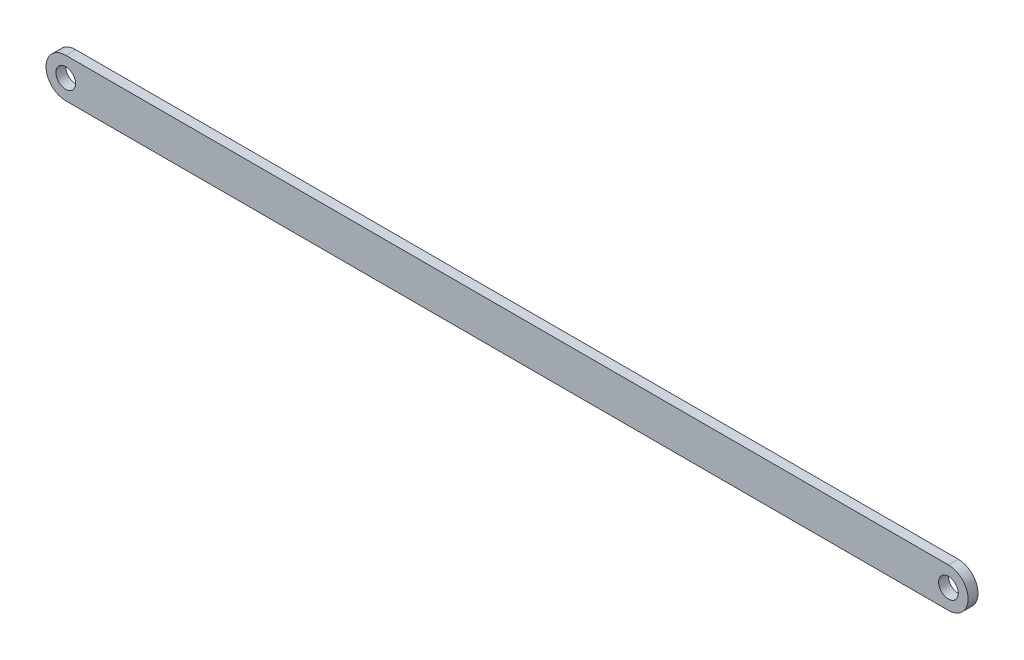
ISO-10303-21;
HEADER;
FILE_DESCRIPTION(('STEP AP214'),'2;1');
FILE_NAME('part.step','',(''),(''),'','','');
FILE_SCHEMA(('AUTOMOTIVE_DESIGN { 1 0 10303 214 1 1 1 1 }'));
ENDSEC;
DATA;
#1=APPLICATION_CONTEXT('core data for automotive mechanical design processes');
#2=APPLICATION_PROTOCOL_DEFINITION('international standard','automotive_design',2000,#1);
#3=PRODUCT_CONTEXT('',#1,'mechanical');
#4=PRODUCT('Part','Part','',(#3));
#5=PRODUCT_RELATED_PRODUCT_CATEGORY('part','',(#4));
#6=PRODUCT_DEFINITION_FORMATION('','',#4);
#7=PRODUCT_DEFINITION_CONTEXT('part definition',#1,'design');
#8=PRODUCT_DEFINITION('design','',#6,#7);
#9=PRODUCT_DEFINITION_SHAPE('','',#8);
#10=(LENGTH_UNIT() NAMED_UNIT(*) SI_UNIT(.MILLI.,.METRE.));
#11=(NAMED_UNIT(*) PLANE_ANGLE_UNIT() SI_UNIT($,.RADIAN.));
#12=(NAMED_UNIT(*) SI_UNIT($,.STERADIAN.) SOLID_ANGLE_UNIT());
#13=UNCERTAINTY_MEASURE_WITH_UNIT(LENGTH_MEASURE(1.E-05),#10,'distance_accuracy_value','');
#14=(GEOMETRIC_REPRESENTATION_CONTEXT(3) GLOBAL_UNCERTAINTY_ASSIGNED_CONTEXT((#13)) GLOBAL_UNIT_ASSIGNED_CONTEXT((#10,
#11,#12)) REPRESENTATION_CONTEXT('',''));
#15=CARTESIAN_POINT('',(0.,0.,0.));
#16=DIRECTION('',(0.,0.,1.));
#17=DIRECTION('',(1.,0.,0.));
#18=AXIS2_PLACEMENT_3D('',#15,#16,#17);
#19=CARTESIAN_POINT('',(44.785,0.,1.));
#20=DIRECTION('',(0.,0.,-1.));
#21=DIRECTION('',(-1.,0.,0.));
#22=AXIS2_PLACEMENT_3D('',#19,#20,#21);
#23=PLANE('',#22);
#24=CARTESIAN_POINT('',(44.785,0.,1.));
#25=DIRECTION('',(0.,0.,1.));
#26=DIRECTION('',(-1.,0.,0.));
#27=AXIS2_PLACEMENT_3D('',#24,#25,#26);
#28=CIRCLE('',#27,2.);
#29=CARTESIAN_POINT('',(44.785,-2.,1.));
#30=VERTEX_POINT('',#29);
#31=CARTESIAN_POINT('',(44.785,2.,1.));
#32=VERTEX_POINT('',#31);
#33=EDGE_CURVE('E96',#30,#32,#28,.T.);
#34=ORIENTED_EDGE('',*,*,#33,.T.);
#35=DIRECTION('',(-1.,0.,0.));
#36=VECTOR('',#35,1.);
#37=CARTESIAN_POINT('',(-44.785,2.,1.));
#38=LINE('',#37,#36);
#39=CARTESIAN_POINT('',(-44.785,2.,1.));
#40=VERTEX_POINT('',#39);
#41=EDGE_CURVE('E91',#32,#40,#38,.T.);
#42=ORIENTED_EDGE('',*,*,#41,.T.);
#43=CARTESIAN_POINT('',(-44.785,0.,1.));
#44=DIRECTION('',(0.,0.,1.));
#45=DIRECTION('',(1.,0.,0.));
#46=AXIS2_PLACEMENT_3D('',#43,#44,#45);
#47=CIRCLE('',#46,2.);
#48=CARTESIAN_POINT('',(-44.785,-2.,1.));
#49=VERTEX_POINT('',#48);
#50=EDGE_CURVE('E94',#40,#49,#47,.T.);
#51=ORIENTED_EDGE('',*,*,#50,.T.);
#52=DIRECTION('',(1.,0.,0.));
#53=VECTOR('',#52,1.);
#54=CARTESIAN_POINT('',(-44.785,-2.,1.));
#55=LINE('',#54,#53);
#56=EDGE_CURVE('E61',#49,#30,#55,.T.);
#57=ORIENTED_EDGE('',*,*,#56,.T.);
#58=EDGE_LOOP('',(#34,#42,#51,#57));
#59=FACE_BOUND('',#58,.T.);
#60=CARTESIAN_POINT('',(-44.785,0.,1.));
#61=DIRECTION('',(0.,0.,1.));
#62=DIRECTION('',(1.,0.,0.));
#63=AXIS2_PLACEMENT_3D('',#60,#61,#62);
#64=CIRCLE('',#63,0.999999999999998);
#65=CARTESIAN_POINT('',(-43.785,0.,1.));
#66=VERTEX_POINT('',#65);
#67=EDGE_CURVE('E116',#66,#66,#64,.T.);
#68=ORIENTED_EDGE('',*,*,#67,.F.);
#69=EDGE_LOOP('',(#68));
#70=FACE_BOUND('',#69,.T.);
#71=CARTESIAN_POINT('',(44.785,0.,1.));
#72=DIRECTION('',(0.,0.,1.));
#73=DIRECTION('',(1.,0.,0.));
#74=AXIS2_PLACEMENT_3D('',#71,#72,#73);
#75=CIRCLE('',#74,0.999999999999998);
#76=CARTESIAN_POINT('',(45.785,0.,1.));
#77=VERTEX_POINT('',#76);
#78=EDGE_CURVE('E138',#77,#77,#75,.T.);
#79=ORIENTED_EDGE('',*,*,#78,.F.);
#80=EDGE_LOOP('',(#79));
#81=FACE_BOUND('',#80,.T.);
#82=ADVANCED_FACE('F43',(#59,#70,#81),#23,.F.);
#83=CARTESIAN_POINT('',(44.785,0.,0.));
#84=DIRECTION('',(0.,0.,-1.));
#85=DIRECTION('',(-1.,0.,0.));
#86=AXIS2_PLACEMENT_3D('',#83,#84,#85);
#87=PLANE('',#86);
#88=CARTESIAN_POINT('',(-44.785,0.,0.));
#89=DIRECTION('',(0.,0.,1.));
#90=DIRECTION('',(1.,0.,0.));
#91=AXIS2_PLACEMENT_3D('',#88,#89,#90);
#92=CIRCLE('',#91,0.999999999999998);
#93=CARTESIAN_POINT('',(-43.785,0.,0.));
#94=VERTEX_POINT('',#93);
#95=EDGE_CURVE('E134',#94,#94,#92,.T.);
#96=ORIENTED_EDGE('',*,*,#95,.T.);
#97=EDGE_LOOP('',(#96));
#98=FACE_BOUND('',#97,.T.);
#99=CARTESIAN_POINT('',(44.785,0.,0.));
#100=DIRECTION('',(0.,0.,1.));
#101=DIRECTION('',(-1.,0.,0.));
#102=AXIS2_PLACEMENT_3D('',#99,#100,#101);
#103=CIRCLE('',#102,2.);
#104=CARTESIAN_POINT('',(44.785,-2.,0.));
#105=VERTEX_POINT('',#104);
#106=CARTESIAN_POINT('',(44.785,2.,0.));
#107=VERTEX_POINT('',#106);
#108=EDGE_CURVE('E112',#105,#107,#103,.T.);
#109=ORIENTED_EDGE('',*,*,#108,.F.);
#110=DIRECTION('',(1.,0.,0.));
#111=VECTOR('',#110,1.);
#112=CARTESIAN_POINT('',(-44.785,-2.,0.));
#113=LINE('',#112,#111);
#114=CARTESIAN_POINT('',(-44.785,-2.,0.));
#115=VERTEX_POINT('',#114);
#116=EDGE_CURVE('E84',#115,#105,#113,.T.);
#117=ORIENTED_EDGE('',*,*,#116,.F.);
#118=CARTESIAN_POINT('',(-44.785,0.,0.));
#119=DIRECTION('',(0.,0.,1.));
#120=DIRECTION('',(1.,0.,0.));
#121=AXIS2_PLACEMENT_3D('',#118,#119,#120);
#122=CIRCLE('',#121,2.);
#123=CARTESIAN_POINT('',(-44.785,2.,0.));
#124=VERTEX_POINT('',#123);
#125=EDGE_CURVE('E78',#124,#115,#122,.T.);
#126=ORIENTED_EDGE('',*,*,#125,.F.);
#127=DIRECTION('',(-1.,0.,0.));
#128=VECTOR('',#127,1.);
#129=CARTESIAN_POINT('',(-44.785,2.,0.));
#130=LINE('',#129,#128);
#131=EDGE_CURVE('E101',#107,#124,#130,.T.);
#132=ORIENTED_EDGE('',*,*,#131,.F.);
#133=EDGE_LOOP('',(#109,#117,#126,#132));
#134=FACE_BOUND('',#133,.T.);
#135=CARTESIAN_POINT('',(44.785,0.,0.));
#136=DIRECTION('',(0.,0.,1.));
#137=DIRECTION('',(1.,0.,0.));
#138=AXIS2_PLACEMENT_3D('',#135,#136,#137);
#139=CIRCLE('',#138,0.999999999999998);
#140=CARTESIAN_POINT('',(45.785,0.,0.));
#141=VERTEX_POINT('',#140);
#142=EDGE_CURVE('E142',#141,#141,#139,.T.);
#143=ORIENTED_EDGE('',*,*,#142,.T.);
#144=EDGE_LOOP('',(#143));
#145=FACE_BOUND('',#144,.T.);
#146=ADVANCED_FACE('F129',(#98,#134,#145),#87,.T.);
#147=CARTESIAN_POINT('',(44.785,0.,1.));
#148=DIRECTION('',(0.,0.,-1.));
#149=DIRECTION('',(-1.,0.,0.));
#150=AXIS2_PLACEMENT_3D('',#147,#148,#149);
#151=CYLINDRICAL_SURFACE('',#150,2.);
#152=ORIENTED_EDGE('',*,*,#108,.T.);
#153=DIRECTION('',(0.,0.,-1.));
#154=VECTOR('',#153,1.);
#155=CARTESIAN_POINT('',(44.785,2.,1.));
#156=LINE('',#155,#154);
#157=EDGE_CURVE('E11',#32,#107,#156,.T.);
#158=ORIENTED_EDGE('',*,*,#157,.F.);
#159=ORIENTED_EDGE('',*,*,#33,.F.);
#160=DIRECTION('',(0.,0.,-1.));
#161=VECTOR('',#160,1.);
#162=CARTESIAN_POINT('',(44.785,-2.,1.));
#163=LINE('',#162,#161);
#164=EDGE_CURVE('E108',#30,#105,#163,.T.);
#165=ORIENTED_EDGE('',*,*,#164,.T.);
#166=EDGE_LOOP('',(#152,#158,#159,#165));
#167=FACE_BOUND('',#166,.T.);
#168=ADVANCED_FACE('F45',(#167),#151,.T.);
#169=CARTESIAN_POINT('',(-44.785,2.,1.));
#170=DIRECTION('',(0.,-1.,0.));
#171=DIRECTION('',(0.,0.,-1.));
#172=AXIS2_PLACEMENT_3D('',#169,#170,#171);
#173=PLANE('',#172);
#174=ORIENTED_EDGE('',*,*,#131,.T.);
#175=DIRECTION('',(0.,0.,-1.));
#176=VECTOR('',#175,1.);
#177=CARTESIAN_POINT('',(-44.785,2.,1.));
#178=LINE('',#177,#176);
#179=EDGE_CURVE('E53',#40,#124,#178,.T.);
#180=ORIENTED_EDGE('',*,*,#179,.F.);
#181=ORIENTED_EDGE('',*,*,#41,.F.);
#182=ORIENTED_EDGE('',*,*,#157,.T.);
#183=EDGE_LOOP('',(#174,#180,#181,#182));
#184=FACE_BOUND('',#183,.T.);
#185=ADVANCED_FACE('F100',(#184),#173,.F.);
#186=CARTESIAN_POINT('',(-44.785,0.,1.));
#187=DIRECTION('',(0.,0.,-1.));
#188=DIRECTION('',(-1.,0.,0.));
#189=AXIS2_PLACEMENT_3D('',#186,#187,#188);
#190=CYLINDRICAL_SURFACE('',#189,2.);
#191=ORIENTED_EDGE('',*,*,#125,.T.);
#192=DIRECTION('',(0.,0.,-1.));
#193=VECTOR('',#192,1.);
#194=CARTESIAN_POINT('',(-44.785,-2.,1.));
#195=LINE('',#194,#193);
#196=EDGE_CURVE('E103',#49,#115,#195,.T.);
#197=ORIENTED_EDGE('',*,*,#196,.F.);
#198=ORIENTED_EDGE('',*,*,#50,.F.);
#199=ORIENTED_EDGE('',*,*,#179,.T.);
#200=EDGE_LOOP('',(#191,#197,#198,#199));
#201=FACE_BOUND('',#200,.T.);
#202=ADVANCED_FACE('F104',(#201),#190,.T.);
#203=CARTESIAN_POINT('',(-44.785,-2.,1.));
#204=DIRECTION('',(0.,1.,0.));
#205=DIRECTION('',(0.,0.,1.));
#206=AXIS2_PLACEMENT_3D('',#203,#204,#205);
#207=PLANE('',#206);
#208=ORIENTED_EDGE('',*,*,#116,.T.);
#209=ORIENTED_EDGE('',*,*,#164,.F.);
#210=ORIENTED_EDGE('',*,*,#56,.F.);
#211=ORIENTED_EDGE('',*,*,#196,.T.);
#212=EDGE_LOOP('',(#208,#209,#210,#211));
#213=FACE_BOUND('',#212,.T.);
#214=ADVANCED_FACE('F126',(#213),#207,.F.);
#215=CARTESIAN_POINT('',(-44.785,0.,1.));
#216=DIRECTION('',(0.,0.,-1.));
#217=DIRECTION('',(-1.,0.,0.));
#218=AXIS2_PLACEMENT_3D('',#215,#216,#217);
#219=CYLINDRICAL_SURFACE('',#218,0.999999999999998);
#220=ORIENTED_EDGE('',*,*,#67,.T.);
#221=EDGE_LOOP('',(#220));
#222=FACE_BOUND('',#221,.T.);
#223=ORIENTED_EDGE('',*,*,#95,.F.);
#224=EDGE_LOOP('',(#223));
#225=FACE_BOUND('',#224,.T.);
#226=ADVANCED_FACE('F161',(#222,#225),#219,.F.);
#227=CARTESIAN_POINT('',(44.785,0.,1.));
#228=DIRECTION('',(0.,0.,-1.));
#229=DIRECTION('',(-1.,0.,0.));
#230=AXIS2_PLACEMENT_3D('',#227,#228,#229);
#231=CYLINDRICAL_SURFACE('',#230,0.999999999999998);
#232=ORIENTED_EDGE('',*,*,#78,.T.);
#233=EDGE_LOOP('',(#232));
#234=FACE_BOUND('',#233,.T.);
#235=ORIENTED_EDGE('',*,*,#142,.F.);
#236=EDGE_LOOP('',(#235));
#237=FACE_BOUND('',#236,.T.);
#238=ADVANCED_FACE('F150',(#234,#237),#231,.F.);
#239=CLOSED_SHELL('',(#82,#146,#168,#185,#202,#214,#226,#238));
#240=MANIFOLD_SOLID_BREP('B2',#239);
#241=ADVANCED_BREP_SHAPE_REPRESENTATION('',(#18,#240),#14);
#242=SHAPE_DEFINITION_REPRESENTATION(#9,#241);
ENDSEC;
END-ISO-10303-21;
